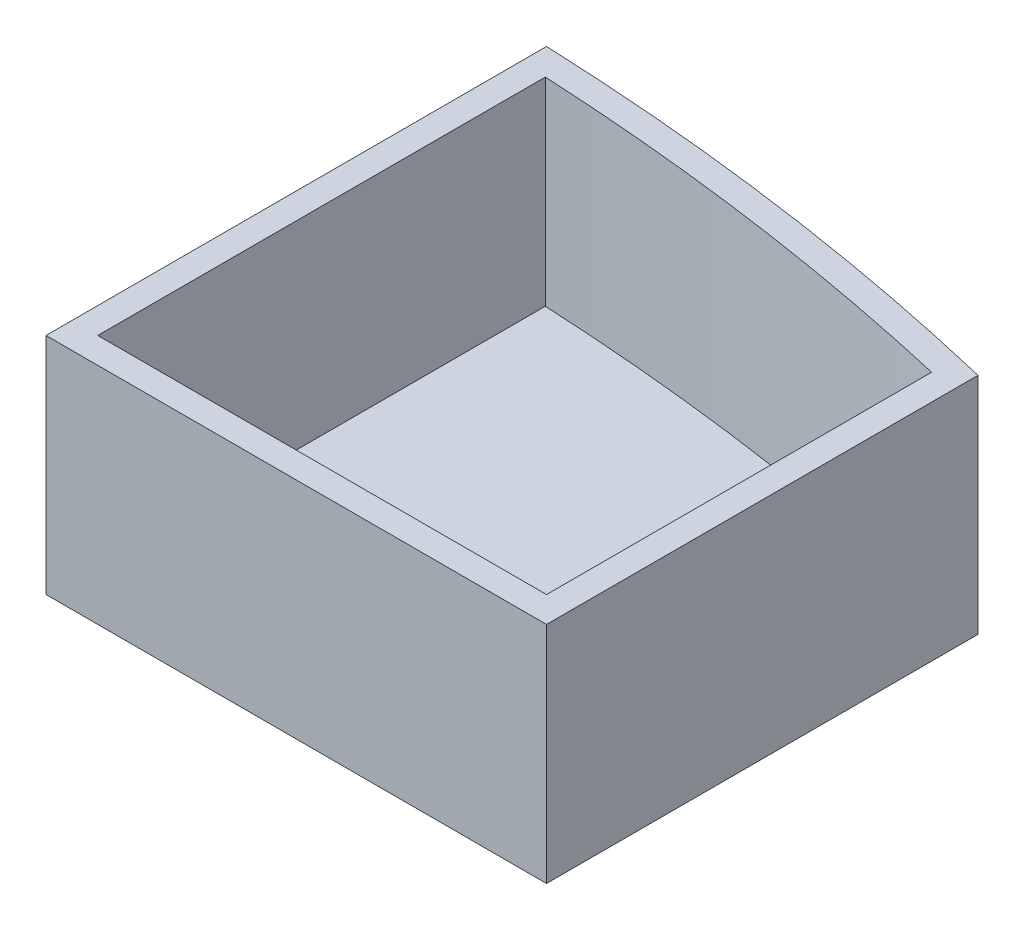
ISO-10303-21;
HEADER;
FILE_DESCRIPTION(('STEP AP214'),'2;1');
FILE_NAME('part.step','',(''),(''),'','','');
FILE_SCHEMA(('AUTOMOTIVE_DESIGN { 1 0 10303 214 1 1 1 1 }'));
ENDSEC;
DATA;
#1=APPLICATION_CONTEXT('core data for automotive mechanical design processes');
#2=APPLICATION_PROTOCOL_DEFINITION('international standard','automotive_design',2000,#1);
#3=PRODUCT_CONTEXT('',#1,'mechanical');
#4=PRODUCT('Part','Part','',(#3));
#5=PRODUCT_RELATED_PRODUCT_CATEGORY('part','',(#4));
#6=PRODUCT_DEFINITION_FORMATION('','',#4);
#7=PRODUCT_DEFINITION_CONTEXT('part definition',#1,'design');
#8=PRODUCT_DEFINITION('design','',#6,#7);
#9=PRODUCT_DEFINITION_SHAPE('','',#8);
#10=(LENGTH_UNIT() NAMED_UNIT(*) SI_UNIT(.MILLI.,.METRE.));
#11=(NAMED_UNIT(*) PLANE_ANGLE_UNIT() SI_UNIT($,.RADIAN.));
#12=(NAMED_UNIT(*) SI_UNIT($,.STERADIAN.) SOLID_ANGLE_UNIT());
#13=UNCERTAINTY_MEASURE_WITH_UNIT(LENGTH_MEASURE(1.E-05),#10,'distance_accuracy_value','');
#14=(GEOMETRIC_REPRESENTATION_CONTEXT(3) GLOBAL_UNCERTAINTY_ASSIGNED_CONTEXT((#13)) GLOBAL_UNIT_ASSIGNED_CONTEXT((#10,
#11,#12)) REPRESENTATION_CONTEXT('',''));
#15=CARTESIAN_POINT('',(0.,0.,0.));
#16=DIRECTION('',(0.,0.,1.));
#17=DIRECTION('',(1.,0.,0.));
#18=AXIS2_PLACEMENT_3D('',#15,#16,#17);
#19=CARTESIAN_POINT('',(-11.7955885687956,3.,299.768017123768));
#20=DIRECTION('',(0.,-1.,0.));
#21=DIRECTION('',(0.,0.,-1.));
#22=AXIS2_PLACEMENT_3D('',#19,#20,#21);
#23=CYLINDRICAL_SURFACE('',#22,300.);
#24=CARTESIAN_POINT('',(25.8088251865321,13.,2.1341681312213));
#25=CARTESIAN_POINT('',(25.8088339458178,13.1961953580661,2.13416906263086));
#26=CARTESIAN_POINT('',(25.8252951909326,13.3925330444048,2.13624759177225));
#27=CARTESIAN_POINT('',(25.8907219930564,13.779792557479,2.14452503795368));
#28=CARTESIAN_POINT('',(25.9397266524446,13.9707075805286,2.15072891179316));
#29=CARTESIAN_POINT('',(26.0688082827388,14.3414469676963,2.16712388079172));
#30=CARTESIAN_POINT('',(26.1488683287989,14.5212773110838,2.17731280416743));
#31=CARTESIAN_POINT('',(26.337726956556,14.8648117548441,2.20145437592484));
#32=CARTESIAN_POINT('',(26.4465186041469,15.0285197331302,2.21540611620274));
#33=CARTESIAN_POINT('',(26.6899076249535,15.3354944997133,2.2467882748812));
#34=CARTESIAN_POINT('',(26.8245432553503,15.4787304276172,2.2642238520365));
#35=CARTESIAN_POINT('',(27.1156709609545,15.7404563564299,2.30216129164701));
#36=CARTESIAN_POINT('',(27.2721641781456,15.8589450635739,2.32266331431741));
#37=CARTESIAN_POINT('',(27.6029856525436,16.0681293929522,2.36630190448804));
#38=CARTESIAN_POINT('',(27.7773591628828,16.1587520524495,2.38944517428868));
#39=CARTESIAN_POINT('',(28.1386464644672,16.309245482135,2.43774611831984));
#40=CARTESIAN_POINT('',(28.3255603804943,16.3691159462759,2.46290381259511));
#41=CARTESIAN_POINT('',(28.7069948672928,16.4565058723174,2.51462719383853));
#42=CARTESIAN_POINT('',(28.9015290978617,16.4839642087489,2.54119544270436));
#43=CARTESIAN_POINT('',(29.2923509200659,16.5055433740818,2.59496967120837));
#44=CARTESIAN_POINT('',(29.4886385146944,16.4996641460589,2.62217565193539));
#45=CARTESIAN_POINT('',(29.8774614836812,16.4547128538275,2.67645639829966));
#46=CARTESIAN_POINT('',(30.0699956150463,16.4156299787127,2.70353111831133));
#47=CARTESIAN_POINT('',(30.4457724947214,16.3053444930129,2.75673206869565));
#48=CARTESIAN_POINT('',(30.6290152734663,16.2341419876473,2.78285830217512));
#49=CARTESIAN_POINT('',(30.9808059581995,16.0617089869351,2.83332455391483));
#50=CARTESIAN_POINT('',(31.1493691235269,15.9605101664319,2.85766642273797));
#51=CARTESIAN_POINT('',(31.4672157069413,15.73091170999,2.90381315233813));
#52=CARTESIAN_POINT('',(31.6164992943853,15.6025123130146,2.92561803540054));
#53=CARTESIAN_POINT('',(31.8912988086336,15.322385467011,2.96593631534618));
#54=CARTESIAN_POINT('',(32.0168537668612,15.1706970846003,2.98445511441639));
#55=CARTESIAN_POINT('',(32.2409254288662,14.8481390939325,3.017619808814));
#56=CARTESIAN_POINT('',(32.3394423547758,14.6772696432746,3.03226573595912));
#57=CARTESIAN_POINT('',(32.5065007341534,14.3214801136945,3.05716116939552));
#58=CARTESIAN_POINT('',(32.5750874736572,14.1365817624133,3.06741731721276));
#59=CARTESIAN_POINT('',(32.6805508575592,13.7577602886891,3.08320812664617));
#60=CARTESIAN_POINT('',(32.7174276919232,13.5638372203182,3.08874281654736));
#61=CARTESIAN_POINT('',(32.7584016617885,13.1726699828919,3.09489331106838));
#62=CARTESIAN_POINT('',(32.7625301044251,12.975429166431,3.09551381360132));
#63=CARTESIAN_POINT('',(32.7379724699261,12.5830479665507,3.09182648899628));
#64=CARTESIAN_POINT('',(32.7092864795425,12.3879075775796,3.08751867488738));
#65=CARTESIAN_POINT('',(32.6199271159536,12.0053169664881,3.07412776012615));
#66=CARTESIAN_POINT('',(32.5592618540249,11.8178648073006,3.0650458703801));
#67=CARTESIAN_POINT('',(32.4076722674787,11.4559127053702,3.04242407453307));
#68=CARTESIAN_POINT('',(32.3167479195651,11.2814127725993,3.0288841649999));
#69=CARTESIAN_POINT('',(32.1071714972237,10.9502259969918,2.99780493413371));
#70=CARTESIAN_POINT('',(31.9885064562978,10.7935475352981,2.98026374262282));
#71=CARTESIAN_POINT('',(31.7268387338224,10.502524232191,2.94177879053943));
#72=CARTESIAN_POINT('',(31.5838359255121,10.368179507108,2.9208350122449));
#73=CARTESIAN_POINT('',(31.2773671603229,10.125466671913,2.87621116592886));
#74=CARTESIAN_POINT('',(31.1138779112144,10.0171285456474,2.85252798571735));
#75=CARTESIAN_POINT('',(30.7711980066507,9.82967113476014,2.80320673706424));
#76=CARTESIAN_POINT('',(30.592007236062,9.75055206441334,2.77756865428823));
#77=CARTESIAN_POINT('',(30.2226912447352,9.62364029532473,2.72509265777991));
#78=CARTESIAN_POINT('',(30.0325487904927,9.57589852233012,2.69825286868861));
#79=CARTESIAN_POINT('',(29.6469763182945,9.51327317183668,2.64421851620916));
#80=CARTESIAN_POINT('',(29.4515462388598,9.49838997654926,2.61702394869793));
#81=CARTESIAN_POINT('',(29.0606176469469,9.50188901067522,2.56302152368499));
#82=CARTESIAN_POINT('',(28.8651195074984,9.52032342730099,2.53621433927026));
#83=CARTESIAN_POINT('',(28.4799049629425,9.59003133004954,2.48377195895628));
#84=CARTESIAN_POINT('',(28.2901886064189,9.64130509203877,2.45813677290433));
#85=CARTESIAN_POINT('',(27.92178901013,9.77529564951239,2.40869826270996));
#86=CARTESIAN_POINT('',(27.7431139820699,9.85803552757983,2.38489629881413));
#87=CARTESIAN_POINT('',(27.4020521013542,10.0526218756029,2.3397491403031));
#88=CARTESIAN_POINT('',(27.2396645825103,10.1644671544224,2.31840384520047));
#89=CARTESIAN_POINT('',(26.9359614334423,10.4139963138861,2.27870553087163));
#90=CARTESIAN_POINT('',(26.794626766046,10.5516565935132,2.26034980688677));
#91=CARTESIAN_POINT('',(26.5368884052887,10.8490378261138,2.22703146513458));
#92=CARTESIAN_POINT('',(26.4204906441413,11.0087640134907,2.21206965469197));
#93=CARTESIAN_POINT('',(26.2162263203192,11.3453939362684,2.18590652507751));
#94=CARTESIAN_POINT('',(26.1283100784723,11.5222670549181,2.17469865688471));
#95=CARTESIAN_POINT('',(25.9833646601465,11.8882697290612,2.15626318450015));
#96=CARTESIAN_POINT('',(25.9262978245861,12.0773840238832,2.14903072718618));
#97=CARTESIAN_POINT('',(25.8599877634537,12.3897673962758,2.14063569018374));
#98=CARTESIAN_POINT('',(25.8408262851239,12.510987824563,2.13821275946779));
#99=CARTESIAN_POINT('',(25.8152422697624,12.7547869673927,2.13497869023943));
#100=CARTESIAN_POINT('',(25.8088197114329,12.8773656796641,2.13416754903231));
#101=CARTESIAN_POINT('',(25.8088251865321,13.,2.1341681312213));
#102=B_SPLINE_CURVE_WITH_KNOTS('',3,(#24,#25,#26,#27,#28,#29,#30,#31,#32,#33,#34,#35,#36,#37,
#38,#39,#40,#41,#42,#43,#44,#45,#46,#47,#48,#49,#50,#51,#52,#53,#54,#55,#56,#57,#58,#59,#60,#61,
#62,#63,#64,#65,#66,#67,#68,#69,#70,#71,#72,#73,#74,#75,#76,#77,#78,#79,#80,#81,#82,#83,#84,#85,
#86,#87,#88,#89,#90,#91,#92,#93,#94,#95,#96,#97,#98,#99,#100,#101),.UNSPECIFIED.,.T.,.F.,(4,2,2,
2,2,2,2,2,2,2,2,2,2,2,2,2,2,2,2,2,2,2,2,2,2,2,2,2,2,2,2,2,2,2,2,2,2,2,4),(0.,0.588137748330938,
1.17698345237585,1.76550869181429,2.35389202572653,2.94315316328315,3.53244509922905,
4.12326711433098,4.71409500920594,5.30603536498883,5.8979767315168,6.49011090446137,
7.08224313767147,7.67375231831247,8.26525630262308,8.85577868330995,9.44629621238757,
10.035917131227,10.6255345177777,11.2145881679865,11.8036402609082,12.3925430174973,
12.981446227478,13.5706252537259,14.1598073487503,14.7496655029131,15.3395279826513,
15.9303454678189,16.5211698253471,17.1129204258098,17.70467599733,18.2968665026453,
18.8890327764218,19.4806602864334,20.0724283821748,20.6631586524052,21.2531661571481,
21.6207895011802,21.9884122305935),.UNSPECIFIED.);
#103=CARTESIAN_POINT('',(25.8088251865321,13.,2.1341681312213));
#104=VERTEX_POINT('',#103);
#105=EDGE_CURVE('E134',#104,#104,#102,.T.);
#106=ORIENTED_EDGE('',*,*,#105,.F.);
#107=EDGE_LOOP('',(#106));
#108=FACE_BOUND('',#107,.T.);
#109=CARTESIAN_POINT('',(-11.7955885687956,0.,299.768017123768));
#110=DIRECTION('',(0.,1.,0.));
#111=DIRECTION('',(0.,0.,-1.));
#112=AXIS2_PLACEMENT_3D('',#109,#110,#111);
#113=CIRCLE('',#112,300.);
#114=CARTESIAN_POINT('',(58.,0.,8.00000000000001));
#115=VERTEX_POINT('',#114);
#116=CARTESIAN_POINT('',(0.,0.,0.));
#117=VERTEX_POINT('',#116);
#118=EDGE_CURVE('E156',#115,#117,#113,.T.);
#119=ORIENTED_EDGE('',*,*,#118,.T.);
#120=DIRECTION('',(0.,-1.,0.));
#121=VECTOR('',#120,1.);
#122=CARTESIAN_POINT('',(0.,3.,0.));
#123=LINE('',#122,#121);
#124=CARTESIAN_POINT('',(0.,26.,0.));
#125=VERTEX_POINT('',#124);
#126=EDGE_CURVE('E11',#125,#117,#123,.T.);
#127=ORIENTED_EDGE('',*,*,#126,.F.);
#128=CARTESIAN_POINT('',(-11.7955885687956,26.,299.768017123768));
#129=DIRECTION('',(0.,1.,0.));
#130=DIRECTION('',(0.,0.,1.));
#131=AXIS2_PLACEMENT_3D('',#128,#129,#130);
#132=CIRCLE('',#131,300.);
#133=CARTESIAN_POINT('',(58.,26.,8.00000000000001));
#134=VERTEX_POINT('',#133);
#135=EDGE_CURVE('E119',#134,#125,#132,.T.);
#136=ORIENTED_EDGE('',*,*,#135,.F.);
#137=DIRECTION('',(0.,-1.,0.));
#138=VECTOR('',#137,1.);
#139=CARTESIAN_POINT('',(58.,3.,8.00000000000001));
#140=LINE('',#139,#138);
#141=EDGE_CURVE('E164',#134,#115,#140,.T.);
#142=ORIENTED_EDGE('',*,*,#141,.T.);
#143=EDGE_LOOP('',(#119,#127,#136,#142));
#144=FACE_BOUND('',#143,.T.);
#145=ADVANCED_FACE('F37',(#108,#144),#23,.T.);
#146=CARTESIAN_POINT('',(0.,3.,0.));
#147=DIRECTION('',(1.,0.,0.));
#148=DIRECTION('',(0.,0.,-1.));
#149=AXIS2_PLACEMENT_3D('',#146,#147,#148);
#150=PLANE('',#149);
#151=DIRECTION('',(0.,0.,1.));
#152=VECTOR('',#151,1.);
#153=CARTESIAN_POINT('',(0.,0.,0.));
#154=LINE('',#153,#152);
#155=CARTESIAN_POINT('',(0.,0.,58.));
#156=VERTEX_POINT('',#155);
#157=EDGE_CURVE('E159',#117,#156,#154,.T.);
#158=ORIENTED_EDGE('',*,*,#157,.T.);
#159=DIRECTION('',(0.,-1.,0.));
#160=VECTOR('',#159,1.);
#161=CARTESIAN_POINT('',(0.,3.,58.));
#162=LINE('',#161,#160);
#163=CARTESIAN_POINT('',(0.,26.,58.));
#164=VERTEX_POINT('',#163);
#165=EDGE_CURVE('E44',#164,#156,#162,.T.);
#166=ORIENTED_EDGE('',*,*,#165,.F.);
#167=DIRECTION('',(0.,0.,1.));
#168=VECTOR('',#167,1.);
#169=CARTESIAN_POINT('',(0.,26.,0.));
#170=LINE('',#169,#168);
#171=EDGE_CURVE('E147',#125,#164,#170,.T.);
#172=ORIENTED_EDGE('',*,*,#171,.F.);
#173=ORIENTED_EDGE('',*,*,#126,.T.);
#174=EDGE_LOOP('',(#158,#166,#172,#173));
#175=FACE_BOUND('',#174,.T.);
#176=ADVANCED_FACE('F182',(#175),#150,.F.);
#177=CARTESIAN_POINT('',(0.,3.,58.));
#178=DIRECTION('',(0.,0.,-1.));
#179=DIRECTION('',(-1.,0.,0.));
#180=AXIS2_PLACEMENT_3D('',#177,#178,#179);
#181=PLANE('',#180);
#182=DIRECTION('',(1.,0.,0.));
#183=VECTOR('',#182,1.);
#184=CARTESIAN_POINT('',(0.,0.,58.));
#185=LINE('',#184,#183);
#186=CARTESIAN_POINT('',(58.,0.,58.));
#187=VERTEX_POINT('',#186);
#188=EDGE_CURVE('E161',#156,#187,#185,.T.);
#189=ORIENTED_EDGE('',*,*,#188,.T.);
#190=DIRECTION('',(0.,-1.,0.));
#191=VECTOR('',#190,1.);
#192=CARTESIAN_POINT('',(58.,3.,58.));
#193=LINE('',#192,#191);
#194=CARTESIAN_POINT('',(58.,26.,58.));
#195=VERTEX_POINT('',#194);
#196=EDGE_CURVE('E166',#195,#187,#193,.T.);
#197=ORIENTED_EDGE('',*,*,#196,.F.);
#198=DIRECTION('',(1.,0.,0.));
#199=VECTOR('',#198,1.);
#200=CARTESIAN_POINT('',(0.,26.,58.));
#201=LINE('',#200,#199);
#202=EDGE_CURVE('E150',#164,#195,#201,.T.);
#203=ORIENTED_EDGE('',*,*,#202,.F.);
#204=ORIENTED_EDGE('',*,*,#165,.T.);
#205=EDGE_LOOP('',(#189,#197,#203,#204));
#206=FACE_BOUND('',#205,.T.);
#207=ADVANCED_FACE('F171',(#206),#181,.F.);
#208=CARTESIAN_POINT('',(58.,3.,58.));
#209=DIRECTION('',(-1.,0.,0.));
#210=DIRECTION('',(0.,0.,1.));
#211=AXIS2_PLACEMENT_3D('',#208,#209,#210);
#212=PLANE('',#211);
#213=DIRECTION('',(0.,0.,-1.));
#214=VECTOR('',#213,1.);
#215=CARTESIAN_POINT('',(58.,0.,58.));
#216=LINE('',#215,#214);
#217=EDGE_CURVE('E59',#187,#115,#216,.T.);
#218=ORIENTED_EDGE('',*,*,#217,.T.);
#219=ORIENTED_EDGE('',*,*,#141,.F.);
#220=DIRECTION('',(0.,0.,-1.));
#221=VECTOR('',#220,1.);
#222=CARTESIAN_POINT('',(58.,26.,58.));
#223=LINE('',#222,#221);
#224=EDGE_CURVE('E153',#195,#134,#223,.T.);
#225=ORIENTED_EDGE('',*,*,#224,.F.);
#226=ORIENTED_EDGE('',*,*,#196,.T.);
#227=EDGE_LOOP('',(#218,#219,#225,#226));
#228=FACE_BOUND('',#227,.T.);
#229=ADVANCED_FACE('F180',(#228),#212,.F.);
#230=CARTESIAN_POINT('',(-11.7955885687956,0.,299.768017123768));
#231=DIRECTION('',(0.,-1.,0.));
#232=DIRECTION('',(0.,0.,-1.));
#233=AXIS2_PLACEMENT_3D('',#230,#231,#232);
#234=PLANE('',#233);
#235=ORIENTED_EDGE('',*,*,#118,.F.);
#236=ORIENTED_EDGE('',*,*,#217,.F.);
#237=ORIENTED_EDGE('',*,*,#188,.F.);
#238=ORIENTED_EDGE('',*,*,#157,.F.);
#239=EDGE_LOOP('',(#235,#236,#237,#238));
#240=FACE_BOUND('',#239,.T.);
#241=ADVANCED_FACE('F176',(#240),#234,.T.);
#242=CARTESIAN_POINT('',(-11.7955885687956,26.,299.768017123768));
#243=DIRECTION('',(0.,1.,0.));
#244=DIRECTION('',(0.,0.,1.));
#245=AXIS2_PLACEMENT_3D('',#242,#243,#244);
#246=PLANE('',#245);
#247=ORIENTED_EDGE('',*,*,#135,.T.);
#248=ORIENTED_EDGE('',*,*,#171,.T.);
#249=ORIENTED_EDGE('',*,*,#202,.T.);
#250=ORIENTED_EDGE('',*,*,#224,.T.);
#251=EDGE_LOOP('',(#247,#248,#249,#250));
#252=FACE_BOUND('',#251,.T.);
#253=DIRECTION('',(0.,0.,1.));
#254=VECTOR('',#253,1.);
#255=CARTESIAN_POINT('',(3.,26.,3.13678046973169));
#256=LINE('',#255,#254);
#257=CARTESIAN_POINT('',(3.,26.,3.13678046973169));
#258=VERTEX_POINT('',#257);
#259=CARTESIAN_POINT('',(3.00000000000001,26.,55.));
#260=VERTEX_POINT('',#259);
#261=EDGE_CURVE('E111',#258,#260,#256,.T.);
#262=ORIENTED_EDGE('',*,*,#261,.F.);
#263=CARTESIAN_POINT('',(-11.7955885687956,26.,299.768017123768));
#264=DIRECTION('',(0.,1.,0.));
#265=DIRECTION('',(0.,0.,1.));
#266=AXIS2_PLACEMENT_3D('',#263,#264,#265);
#267=CIRCLE('',#266,297.);
#268=CARTESIAN_POINT('',(55.,26.,10.3766742198239));
#269=VERTEX_POINT('',#268);
#270=EDGE_CURVE('E103',#269,#258,#267,.T.);
#271=ORIENTED_EDGE('',*,*,#270,.F.);
#272=DIRECTION('',(0.,0.,-1.));
#273=VECTOR('',#272,1.);
#274=CARTESIAN_POINT('',(55.,26.,55.));
#275=LINE('',#274,#273);
#276=CARTESIAN_POINT('',(55.,26.,55.));
#277=VERTEX_POINT('',#276);
#278=EDGE_CURVE('E127',#277,#269,#275,.T.);
#279=ORIENTED_EDGE('',*,*,#278,.F.);
#280=DIRECTION('',(1.,0.,0.));
#281=VECTOR('',#280,1.);
#282=CARTESIAN_POINT('',(3.00000000000001,26.,55.));
#283=LINE('',#282,#281);
#284=EDGE_CURVE('E125',#260,#277,#283,.T.);
#285=ORIENTED_EDGE('',*,*,#284,.F.);
#286=EDGE_LOOP('',(#262,#271,#279,#285));
#287=FACE_BOUND('',#286,.T.);
#288=ADVANCED_FACE('F123',(#252,#287),#246,.T.);
#289=CARTESIAN_POINT('',(-11.7955885687956,26.,299.768017123768));
#290=DIRECTION('',(0.,-1.,0.));
#291=DIRECTION('',(0.,0.,-1.));
#292=AXIS2_PLACEMENT_3D('',#289,#290,#291);
#293=CYLINDRICAL_SURFACE('',#292,297.);
#294=CARTESIAN_POINT('',(-11.7955885687956,3.,299.768017123768));
#295=DIRECTION('',(0.,1.,0.));
#296=DIRECTION('',(0.,0.,1.));
#297=AXIS2_PLACEMENT_3D('',#294,#295,#296);
#298=CIRCLE('',#297,297.);
#299=CARTESIAN_POINT('',(55.,3.,10.3766742198239));
#300=VERTEX_POINT('',#299);
#301=CARTESIAN_POINT('',(3.,3.,3.13678046973169));
#302=VERTEX_POINT('',#301);
#303=EDGE_CURVE('E132',#300,#302,#298,.T.);
#304=ORIENTED_EDGE('',*,*,#303,.F.);
#305=DIRECTION('',(0.,-1.,0.));
#306=VECTOR('',#305,1.);
#307=CARTESIAN_POINT('',(55.,26.,10.3766742198239));
#308=LINE('',#307,#306);
#309=EDGE_CURVE('E51',#269,#300,#308,.T.);
#310=ORIENTED_EDGE('',*,*,#309,.F.);
#311=ORIENTED_EDGE('',*,*,#270,.T.);
#312=DIRECTION('',(0.,-1.,0.));
#313=VECTOR('',#312,1.);
#314=CARTESIAN_POINT('',(3.,26.,3.13678046973169));
#315=LINE('',#314,#313);
#316=EDGE_CURVE('E106',#258,#302,#315,.T.);
#317=ORIENTED_EDGE('',*,*,#316,.T.);
#318=EDGE_LOOP('',(#304,#310,#311,#317));
#319=FACE_BOUND('',#318,.T.);
#320=ADVANCED_FACE('F105',(#319),#293,.F.);
#321=CARTESIAN_POINT('',(3.,26.,3.13678046973169));
#322=DIRECTION('',(1.,0.,0.));
#323=DIRECTION('',(0.,0.,-1.));
#324=AXIS2_PLACEMENT_3D('',#321,#322,#323);
#325=PLANE('',#324);
#326=DIRECTION('',(0.,0.,1.));
#327=VECTOR('',#326,1.);
#328=CARTESIAN_POINT('',(3.,3.,3.13678046973169));
#329=LINE('',#328,#327);
#330=CARTESIAN_POINT('',(3.00000000000001,3.,55.));
#331=VERTEX_POINT('',#330);
#332=EDGE_CURVE('E118',#302,#331,#329,.T.);
#333=ORIENTED_EDGE('',*,*,#332,.F.);
#334=ORIENTED_EDGE('',*,*,#316,.F.);
#335=ORIENTED_EDGE('',*,*,#261,.T.);
#336=DIRECTION('',(0.,-1.,0.));
#337=VECTOR('',#336,1.);
#338=CARTESIAN_POINT('',(3.00000000000001,26.,55.));
#339=LINE('',#338,#337);
#340=EDGE_CURVE('E120',#260,#331,#339,.T.);
#341=ORIENTED_EDGE('',*,*,#340,.T.);
#342=EDGE_LOOP('',(#333,#334,#335,#341));
#343=FACE_BOUND('',#342,.T.);
#344=ADVANCED_FACE('F115',(#343),#325,.T.);
#345=CARTESIAN_POINT('',(3.00000000000001,26.,55.));
#346=DIRECTION('',(0.,0.,-1.));
#347=DIRECTION('',(-1.,0.,0.));
#348=AXIS2_PLACEMENT_3D('',#345,#346,#347);
#349=PLANE('',#348);
#350=DIRECTION('',(1.,0.,0.));
#351=VECTOR('',#350,1.);
#352=CARTESIAN_POINT('',(3.00000000000001,3.,55.));
#353=LINE('',#352,#351);
#354=CARTESIAN_POINT('',(55.,3.,55.));
#355=VERTEX_POINT('',#354);
#356=EDGE_CURVE('E136',#331,#355,#353,.T.);
#357=ORIENTED_EDGE('',*,*,#356,.F.);
#358=ORIENTED_EDGE('',*,*,#340,.F.);
#359=ORIENTED_EDGE('',*,*,#284,.T.);
#360=DIRECTION('',(0.,-1.,0.));
#361=VECTOR('',#360,1.);
#362=CARTESIAN_POINT('',(55.,26.,55.));
#363=LINE('',#362,#361);
#364=EDGE_CURVE('E142',#277,#355,#363,.T.);
#365=ORIENTED_EDGE('',*,*,#364,.T.);
#366=EDGE_LOOP('',(#357,#358,#359,#365));
#367=FACE_BOUND('',#366,.T.);
#368=ADVANCED_FACE('F207',(#367),#349,.T.);
#369=CARTESIAN_POINT('',(55.,26.,55.));
#370=DIRECTION('',(-1.,0.,0.));
#371=DIRECTION('',(0.,0.,1.));
#372=AXIS2_PLACEMENT_3D('',#369,#370,#371);
#373=PLANE('',#372);
#374=DIRECTION('',(0.,0.,-1.));
#375=VECTOR('',#374,1.);
#376=CARTESIAN_POINT('',(55.,3.,55.));
#377=LINE('',#376,#375);
#378=EDGE_CURVE('E112',#355,#300,#377,.T.);
#379=ORIENTED_EDGE('',*,*,#378,.F.);
#380=ORIENTED_EDGE('',*,*,#364,.F.);
#381=ORIENTED_EDGE('',*,*,#278,.T.);
#382=ORIENTED_EDGE('',*,*,#309,.T.);
#383=EDGE_LOOP('',(#379,#380,#381,#382));
#384=FACE_BOUND('',#383,.T.);
#385=ADVANCED_FACE('F199',(#384),#373,.T.);
#386=CARTESIAN_POINT('',(-11.7955885687956,3.,299.768017123768));
#387=DIRECTION('',(0.,-1.,0.));
#388=DIRECTION('',(0.,0.,-1.));
#389=AXIS2_PLACEMENT_3D('',#386,#387,#388);
#390=PLANE('',#389);
#391=ORIENTED_EDGE('',*,*,#378,.T.);
#392=ORIENTED_EDGE('',*,*,#303,.T.);
#393=ORIENTED_EDGE('',*,*,#332,.T.);
#394=ORIENTED_EDGE('',*,*,#356,.T.);
#395=EDGE_LOOP('',(#391,#392,#393,#394));
#396=FACE_BOUND('',#395,.T.);
#397=ADVANCED_FACE('F195',(#396),#390,.F.);
#398=CARTESIAN_POINT('',(17.2509468829793,13.,61.5253946274292));
#399=DIRECTION('',(0.200110057327612,0.,-0.979773425316455));
#400=DIRECTION('',(-0.979773425316455,0.,-0.200110057327612));
#401=AXIS2_PLACEMENT_3D('',#398,#399,#400);
#402=CYLINDRICAL_SURFACE('',#401,3.5);
#403=ORIENTED_EDGE('',*,*,#105,.T.);
#404=EDGE_LOOP('',(#403));
#405=FACE_BOUND('',#404,.T.);
#406=CARTESIAN_POINT('',(30.8111459405443,13.,-4.86768354181183));
#407=DIRECTION('',(0.200110057327612,0.,-0.979773425316455));
#408=DIRECTION('',(-0.979773425316455,0.,-0.200110057327612));
#409=AXIS2_PLACEMENT_3D('',#406,#407,#408);
#410=CIRCLE('',#409,3.5);
#411=CARTESIAN_POINT('',(27.3819389519367,13.,-5.56806874245848));
#412=VERTEX_POINT('',#411);
#413=EDGE_CURVE('E225',#412,#412,#410,.T.);
#414=ORIENTED_EDGE('',*,*,#413,.F.);
#415=EDGE_LOOP('',(#414));
#416=FACE_BOUND('',#415,.T.);
#417=ADVANCED_FACE('F198',(#405,#416),#402,.T.);
#418=CARTESIAN_POINT('',(30.8111459405443,13.,-4.86768354181183));
#419=DIRECTION('',(0.200110057327612,0.,-0.979773425316455));
#420=DIRECTION('',(-0.979773425316455,0.,-0.200110057327612));
#421=AXIS2_PLACEMENT_3D('',#418,#419,#420);
#422=PLANE('',#421);
#423=ORIENTED_EDGE('',*,*,#413,.T.);
#424=EDGE_LOOP('',(#423));
#425=FACE_BOUND('',#424,.T.);
#426=ADVANCED_FACE('F216',(#425),#422,.T.);
#427=CLOSED_SHELL('',(#145,#176,#207,#229,#241,#288,#320,#344,#368,#385,#397,#417,#426));
#428=MANIFOLD_SOLID_BREP('B2',#427);
#429=ADVANCED_BREP_SHAPE_REPRESENTATION('',(#18,#428),#14);
#430=SHAPE_DEFINITION_REPRESENTATION(#9,#429);
ENDSEC;
END-ISO-10303-21;
